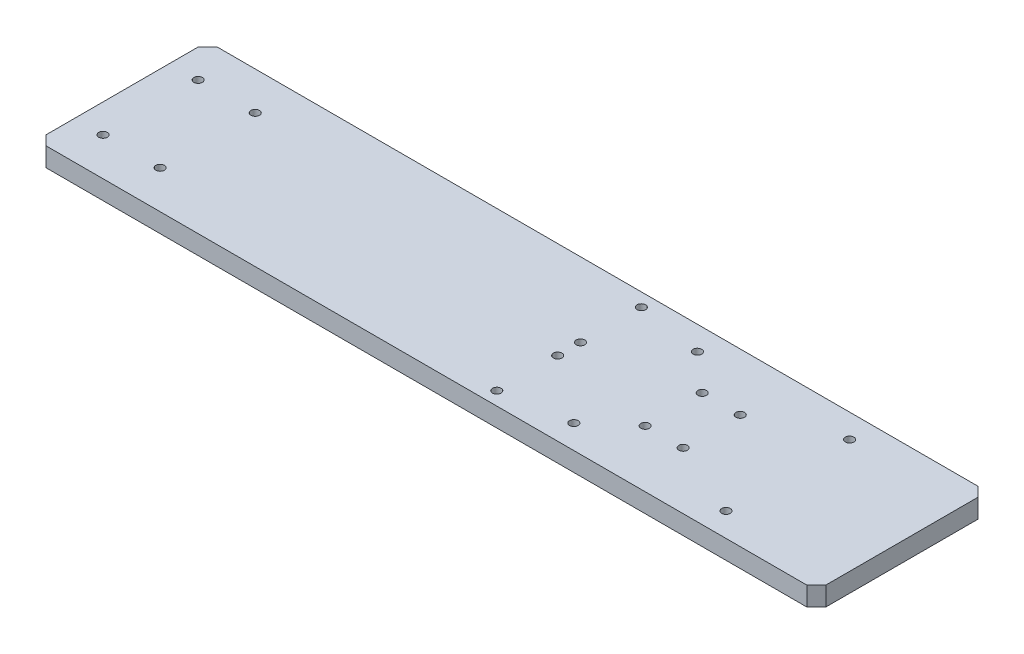
ISO-10303-21;
HEADER;
FILE_DESCRIPTION(('STEP AP214'),'2;1');
FILE_NAME('part.step','',(''),(''),'','','');
FILE_SCHEMA(('AUTOMOTIVE_DESIGN { 1 0 10303 214 1 1 1 1 }'));
ENDSEC;
DATA;
#1=APPLICATION_CONTEXT('core data for automotive mechanical design processes');
#2=APPLICATION_PROTOCOL_DEFINITION('international standard','automotive_design',2000,#1);
#3=PRODUCT_CONTEXT('',#1,'mechanical');
#4=PRODUCT('Part','Part','',(#3));
#5=PRODUCT_RELATED_PRODUCT_CATEGORY('part','',(#4));
#6=PRODUCT_DEFINITION_FORMATION('','',#4);
#7=PRODUCT_DEFINITION_CONTEXT('part definition',#1,'design');
#8=PRODUCT_DEFINITION('design','',#6,#7);
#9=PRODUCT_DEFINITION_SHAPE('','',#8);
#10=(LENGTH_UNIT() NAMED_UNIT(*) SI_UNIT(.MILLI.,.METRE.));
#11=(NAMED_UNIT(*) PLANE_ANGLE_UNIT() SI_UNIT($,.RADIAN.));
#12=(NAMED_UNIT(*) SI_UNIT($,.STERADIAN.) SOLID_ANGLE_UNIT());
#13=UNCERTAINTY_MEASURE_WITH_UNIT(LENGTH_MEASURE(1.E-05),#10,'distance_accuracy_value','');
#14=(GEOMETRIC_REPRESENTATION_CONTEXT(3) GLOBAL_UNCERTAINTY_ASSIGNED_CONTEXT((#13)) GLOBAL_UNIT_ASSIGNED_CONTEXT((#10,
#11,#12)) REPRESENTATION_CONTEXT('',''));
#15=CARTESIAN_POINT('',(0.,0.,0.));
#16=DIRECTION('',(0.,0.,1.));
#17=DIRECTION('',(1.,0.,0.));
#18=AXIS2_PLACEMENT_3D('',#15,#16,#17);
#19=CARTESIAN_POINT('',(410.,10.,45.));
#20=DIRECTION('',(-1.,0.,0.));
#21=DIRECTION('',(0.,0.,1.));
#22=AXIS2_PLACEMENT_3D('',#19,#20,#21);
#23=PLANE('',#22);
#24=DIRECTION('',(0.,0.,-1.));
#25=VECTOR('',#24,1.);
#26=CARTESIAN_POINT('',(410.,10.,45.));
#27=LINE('',#26,#25);
#28=CARTESIAN_POINT('',(410.,10.,40.));
#29=VERTEX_POINT('',#28);
#30=CARTESIAN_POINT('',(410.,10.,-40.));
#31=VERTEX_POINT('',#30);
#32=EDGE_CURVE('E129',#29,#31,#27,.T.);
#33=ORIENTED_EDGE('',*,*,#32,.F.);
#34=DIRECTION('',(0.,-1.,0.));
#35=VECTOR('',#34,1.);
#36=CARTESIAN_POINT('',(410.,10.,40.));
#37=LINE('',#36,#35);
#38=CARTESIAN_POINT('',(410.,0.,40.));
#39=VERTEX_POINT('',#38);
#40=EDGE_CURVE('E11',#29,#39,#37,.T.);
#41=ORIENTED_EDGE('',*,*,#40,.T.);
#42=DIRECTION('',(0.,0.,-1.));
#43=VECTOR('',#42,1.);
#44=CARTESIAN_POINT('',(410.,0.,45.));
#45=LINE('',#44,#43);
#46=CARTESIAN_POINT('',(410.,0.,-40.));
#47=VERTEX_POINT('',#46);
#48=EDGE_CURVE('E131',#39,#47,#45,.T.);
#49=ORIENTED_EDGE('',*,*,#48,.T.);
#50=DIRECTION('',(0.,1.,0.));
#51=VECTOR('',#50,1.);
#52=CARTESIAN_POINT('',(410.,10.,-40.));
#53=LINE('',#52,#51);
#54=EDGE_CURVE('E42',#47,#31,#53,.T.);
#55=ORIENTED_EDGE('',*,*,#54,.T.);
#56=EDGE_LOOP('',(#33,#41,#49,#55));
#57=FACE_BOUND('',#56,.T.);
#58=ADVANCED_FACE('F34',(#57),#23,.F.);
#59=CARTESIAN_POINT('',(0.,10.,-45.));
#60=DIRECTION('',(0.,0.,1.));
#61=DIRECTION('',(1.,0.,0.));
#62=AXIS2_PLACEMENT_3D('',#59,#60,#61);
#63=PLANE('',#62);
#64=DIRECTION('',(-1.,0.,0.));
#65=VECTOR('',#64,1.);
#66=CARTESIAN_POINT('',(0.,0.,-45.));
#67=LINE('',#66,#65);
#68=CARTESIAN_POINT('',(405.,0.,-45.));
#69=VERTEX_POINT('',#68);
#70=CARTESIAN_POINT('',(4.99999999999995,0.,-45.));
#71=VERTEX_POINT('',#70);
#72=EDGE_CURVE('E127',#69,#71,#67,.T.);
#73=ORIENTED_EDGE('',*,*,#72,.T.);
#74=DIRECTION('',(0.,1.,0.));
#75=VECTOR('',#74,1.);
#76=CARTESIAN_POINT('',(4.99999999999995,10.,-45.));
#77=LINE('',#76,#75);
#78=CARTESIAN_POINT('',(4.99999999999995,10.,-45.));
#79=VERTEX_POINT('',#78);
#80=EDGE_CURVE('E106',#71,#79,#77,.T.);
#81=ORIENTED_EDGE('',*,*,#80,.T.);
#82=DIRECTION('',(-1.,0.,0.));
#83=VECTOR('',#82,1.);
#84=CARTESIAN_POINT('',(0.,10.,-45.));
#85=LINE('',#84,#83);
#86=CARTESIAN_POINT('',(405.,10.,-45.));
#87=VERTEX_POINT('',#86);
#88=EDGE_CURVE('E167',#87,#79,#85,.T.);
#89=ORIENTED_EDGE('',*,*,#88,.F.);
#90=DIRECTION('',(0.,-1.,0.));
#91=VECTOR('',#90,1.);
#92=CARTESIAN_POINT('',(405.,10.,-45.));
#93=LINE('',#92,#91);
#94=EDGE_CURVE('E111',#87,#69,#93,.T.);
#95=ORIENTED_EDGE('',*,*,#94,.T.);
#96=EDGE_LOOP('',(#73,#81,#89,#95));
#97=FACE_BOUND('',#96,.T.);
#98=ADVANCED_FACE('F171',(#97),#63,.F.);
#99=CARTESIAN_POINT('',(0.,10.,45.));
#100=DIRECTION('',(1.,0.,0.));
#101=DIRECTION('',(0.,0.,-1.));
#102=AXIS2_PLACEMENT_3D('',#99,#100,#101);
#103=PLANE('',#102);
#104=DIRECTION('',(0.,0.,1.));
#105=VECTOR('',#104,1.);
#106=CARTESIAN_POINT('',(0.,10.,45.));
#107=LINE('',#106,#105);
#108=CARTESIAN_POINT('',(0.,10.,-40.));
#109=VERTEX_POINT('',#108);
#110=CARTESIAN_POINT('',(0.,10.,40.));
#111=VERTEX_POINT('',#110);
#112=EDGE_CURVE('E120',#109,#111,#107,.T.);
#113=ORIENTED_EDGE('',*,*,#112,.F.);
#114=DIRECTION('',(0.,-1.,0.));
#115=VECTOR('',#114,1.);
#116=CARTESIAN_POINT('',(0.,10.,-40.));
#117=LINE('',#116,#115);
#118=CARTESIAN_POINT('',(0.,0.,-40.));
#119=VERTEX_POINT('',#118);
#120=EDGE_CURVE('E105',#109,#119,#117,.T.);
#121=ORIENTED_EDGE('',*,*,#120,.T.);
#122=DIRECTION('',(0.,0.,1.));
#123=VECTOR('',#122,1.);
#124=CARTESIAN_POINT('',(0.,0.,45.));
#125=LINE('',#124,#123);
#126=CARTESIAN_POINT('',(0.,0.,40.));
#127=VERTEX_POINT('',#126);
#128=EDGE_CURVE('E118',#119,#127,#125,.T.);
#129=ORIENTED_EDGE('',*,*,#128,.T.);
#130=DIRECTION('',(0.,1.,0.));
#131=VECTOR('',#130,1.);
#132=CARTESIAN_POINT('',(0.,10.,40.));
#133=LINE('',#132,#131);
#134=EDGE_CURVE('E122',#127,#111,#133,.T.);
#135=ORIENTED_EDGE('',*,*,#134,.T.);
#136=EDGE_LOOP('',(#113,#121,#129,#135));
#137=FACE_BOUND('',#136,.T.);
#138=ADVANCED_FACE('F117',(#137),#103,.F.);
#139=CARTESIAN_POINT('',(0.,10.,45.));
#140=DIRECTION('',(0.,0.,-1.));
#141=DIRECTION('',(-1.,0.,0.));
#142=AXIS2_PLACEMENT_3D('',#139,#140,#141);
#143=PLANE('',#142);
#144=DIRECTION('',(1.,0.,0.));
#145=VECTOR('',#144,1.);
#146=CARTESIAN_POINT('',(0.,10.,45.));
#147=LINE('',#146,#145);
#148=CARTESIAN_POINT('',(4.99999999999995,10.,45.));
#149=VERTEX_POINT('',#148);
#150=CARTESIAN_POINT('',(405.,10.,45.));
#151=VERTEX_POINT('',#150);
#152=EDGE_CURVE('E135',#149,#151,#147,.T.);
#153=ORIENTED_EDGE('',*,*,#152,.F.);
#154=DIRECTION('',(0.,-1.,0.));
#155=VECTOR('',#154,1.);
#156=CARTESIAN_POINT('',(4.99999999999995,10.,45.));
#157=LINE('',#156,#155);
#158=CARTESIAN_POINT('',(4.99999999999995,0.,45.));
#159=VERTEX_POINT('',#158);
#160=EDGE_CURVE('E152',#149,#159,#157,.T.);
#161=ORIENTED_EDGE('',*,*,#160,.T.);
#162=DIRECTION('',(1.,0.,0.));
#163=VECTOR('',#162,1.);
#164=CARTESIAN_POINT('',(0.,0.,45.));
#165=LINE('',#164,#163);
#166=CARTESIAN_POINT('',(405.,0.,45.));
#167=VERTEX_POINT('',#166);
#168=EDGE_CURVE('E126',#159,#167,#165,.T.);
#169=ORIENTED_EDGE('',*,*,#168,.T.);
#170=DIRECTION('',(0.,1.,0.));
#171=VECTOR('',#170,1.);
#172=CARTESIAN_POINT('',(405.,10.,45.));
#173=LINE('',#172,#171);
#174=EDGE_CURVE('E49',#167,#151,#173,.T.);
#175=ORIENTED_EDGE('',*,*,#174,.T.);
#176=EDGE_LOOP('',(#153,#161,#169,#175));
#177=FACE_BOUND('',#176,.T.);
#178=ADVANCED_FACE('F628',(#177),#143,.F.);
#179=CARTESIAN_POINT('',(0.,10.,0.));
#180=DIRECTION('',(0.,-1.,0.));
#181=DIRECTION('',(0.,0.,-1.));
#182=AXIS2_PLACEMENT_3D('',#179,#180,#181);
#183=PLANE('',#182);
#184=CARTESIAN_POINT('',(270.,9.99999999999999,-32.5));
#185=DIRECTION('',(0.,-1.,0.));
#186=DIRECTION('',(0.,0.,-1.));
#187=AXIS2_PLACEMENT_3D('',#184,#185,#186);
#188=CIRCLE('',#187,2.24999999999997);
#189=CARTESIAN_POINT('',(270.,9.99999999999999,-34.75));
#190=VERTEX_POINT('',#189);
#191=EDGE_CURVE('E311',#190,#190,#188,.T.);
#192=ORIENTED_EDGE('',*,*,#191,.T.);
#193=EDGE_LOOP('',(#192));
#194=FACE_BOUND('',#193,.T.);
#195=CARTESIAN_POINT('',(350.,9.99999999999999,32.5));
#196=DIRECTION('',(0.,-1.,0.));
#197=DIRECTION('',(0.,0.,-1.));
#198=AXIS2_PLACEMENT_3D('',#195,#196,#197);
#199=CIRCLE('',#198,2.24999999999997);
#200=CARTESIAN_POINT('',(350.,9.99999999999999,30.25));
#201=VERTEX_POINT('',#200);
#202=EDGE_CURVE('E302',#201,#201,#199,.T.);
#203=ORIENTED_EDGE('',*,*,#202,.T.);
#204=EDGE_LOOP('',(#203));
#205=FACE_BOUND('',#204,.T.);
#206=CARTESIAN_POINT('',(350.,9.99999999999999,-32.5));
#207=DIRECTION('',(0.,-1.,0.));
#208=DIRECTION('',(0.,0.,-1.));
#209=AXIS2_PLACEMENT_3D('',#206,#207,#208);
#210=CIRCLE('',#209,2.24999999999997);
#211=CARTESIAN_POINT('',(350.,9.99999999999999,-34.75));
#212=VERTEX_POINT('',#211);
#213=EDGE_CURVE('E293',#212,#212,#210,.T.);
#214=ORIENTED_EDGE('',*,*,#213,.T.);
#215=EDGE_LOOP('',(#214));
#216=FACE_BOUND('',#215,.T.);
#217=CARTESIAN_POINT('',(270.,9.99999999999999,32.5));
#218=DIRECTION('',(0.,-1.,0.));
#219=DIRECTION('',(0.,0.,-1.));
#220=AXIS2_PLACEMENT_3D('',#217,#218,#219);
#221=CIRCLE('',#220,2.24999999999997);
#222=CARTESIAN_POINT('',(270.,9.99999999999999,30.25));
#223=VERTEX_POINT('',#222);
#224=EDGE_CURVE('E284',#223,#223,#221,.T.);
#225=ORIENTED_EDGE('',*,*,#224,.T.);
#226=EDGE_LOOP('',(#225));
#227=FACE_BOUND('',#226,.T.);
#228=CARTESIAN_POINT('',(290.,10.,-15.));
#229=DIRECTION('',(0.,-1.,0.));
#230=DIRECTION('',(0.,0.,-1.));
#231=AXIS2_PLACEMENT_3D('',#228,#229,#230);
#232=CIRCLE('',#231,2.24999999999997);
#233=CARTESIAN_POINT('',(290.,10.,-17.25));
#234=VERTEX_POINT('',#233);
#235=EDGE_CURVE('E275',#234,#234,#232,.T.);
#236=ORIENTED_EDGE('',*,*,#235,.T.);
#237=EDGE_LOOP('',(#236));
#238=FACE_BOUND('',#237,.T.);
#239=CARTESIAN_POINT('',(310.,10.,15.));
#240=DIRECTION('',(0.,-1.,0.));
#241=DIRECTION('',(0.,0.,-1.));
#242=AXIS2_PLACEMENT_3D('',#239,#240,#241);
#243=CIRCLE('',#242,2.24999999999997);
#244=CARTESIAN_POINT('',(310.,10.,12.75));
#245=VERTEX_POINT('',#244);
#246=EDGE_CURVE('E266',#245,#245,#243,.T.);
#247=ORIENTED_EDGE('',*,*,#246,.T.);
#248=EDGE_LOOP('',(#247));
#249=FACE_BOUND('',#248,.T.);
#250=CARTESIAN_POINT('',(310.,10.,-15.));
#251=DIRECTION('',(0.,-1.,0.));
#252=DIRECTION('',(0.,0.,-1.));
#253=AXIS2_PLACEMENT_3D('',#250,#251,#252);
#254=CIRCLE('',#253,2.24999999999997);
#255=CARTESIAN_POINT('',(310.,10.,-17.25));
#256=VERTEX_POINT('',#255);
#257=EDGE_CURVE('E257',#256,#256,#254,.T.);
#258=ORIENTED_EDGE('',*,*,#257,.T.);
#259=EDGE_LOOP('',(#258));
#260=FACE_BOUND('',#259,.T.);
#261=CARTESIAN_POINT('',(290.,10.,15.));
#262=DIRECTION('',(0.,-1.,0.));
#263=DIRECTION('',(0.,0.,-1.));
#264=AXIS2_PLACEMENT_3D('',#261,#262,#263);
#265=CIRCLE('',#264,2.24999999999997);
#266=CARTESIAN_POINT('',(290.,10.,12.75));
#267=VERTEX_POINT('',#266);
#268=EDGE_CURVE('E248',#267,#267,#265,.T.);
#269=ORIENTED_EDGE('',*,*,#268,.T.);
#270=EDGE_LOOP('',(#269));
#271=FACE_BOUND('',#270,.T.);
#272=CARTESIAN_POINT('',(235.,10.,-38.));
#273=DIRECTION('',(0.,-1.,0.));
#274=DIRECTION('',(0.,0.,-1.));
#275=AXIS2_PLACEMENT_3D('',#272,#273,#274);
#276=CIRCLE('',#275,2.25);
#277=CARTESIAN_POINT('',(235.,10.,-40.25));
#278=VERTEX_POINT('',#277);
#279=EDGE_CURVE('E239',#278,#278,#276,.T.);
#280=ORIENTED_EDGE('',*,*,#279,.T.);
#281=EDGE_LOOP('',(#280));
#282=FACE_BOUND('',#281,.T.);
#283=CARTESIAN_POINT('',(235.,10.,-6.));
#284=DIRECTION('',(0.,-1.,0.));
#285=DIRECTION('',(0.,0.,-1.));
#286=AXIS2_PLACEMENT_3D('',#283,#284,#285);
#287=CIRCLE('',#286,2.25);
#288=CARTESIAN_POINT('',(235.,10.,-8.25));
#289=VERTEX_POINT('',#288);
#290=EDGE_CURVE('E230',#289,#289,#287,.T.);
#291=ORIENTED_EDGE('',*,*,#290,.T.);
#292=EDGE_LOOP('',(#291));
#293=FACE_BOUND('',#292,.T.);
#294=CARTESIAN_POINT('',(235.,10.,6.));
#295=DIRECTION('',(0.,-1.,0.));
#296=DIRECTION('',(0.,0.,-1.));
#297=AXIS2_PLACEMENT_3D('',#294,#295,#296);
#298=CIRCLE('',#297,2.25);
#299=CARTESIAN_POINT('',(235.,10.,3.75));
#300=VERTEX_POINT('',#299);
#301=EDGE_CURVE('E221',#300,#300,#298,.T.);
#302=ORIENTED_EDGE('',*,*,#301,.T.);
#303=EDGE_LOOP('',(#302));
#304=FACE_BOUND('',#303,.T.);
#305=CARTESIAN_POINT('',(235.,10.,38.));
#306=DIRECTION('',(0.,-1.,0.));
#307=DIRECTION('',(0.,0.,-1.));
#308=AXIS2_PLACEMENT_3D('',#305,#306,#307);
#309=CIRCLE('',#308,2.25);
#310=CARTESIAN_POINT('',(235.,10.,35.75));
#311=VERTEX_POINT('',#310);
#312=EDGE_CURVE('E212',#311,#311,#309,.T.);
#313=ORIENTED_EDGE('',*,*,#312,.T.);
#314=EDGE_LOOP('',(#313));
#315=FACE_BOUND('',#314,.T.);
#316=CARTESIAN_POINT('',(15.,10.,25.));
#317=DIRECTION('',(0.,-1.,0.));
#318=DIRECTION('',(0.,0.,-1.));
#319=AXIS2_PLACEMENT_3D('',#316,#317,#318);
#320=CIRCLE('',#319,2.25);
#321=CARTESIAN_POINT('',(15.,10.,22.75));
#322=VERTEX_POINT('',#321);
#323=EDGE_CURVE('E203',#322,#322,#320,.T.);
#324=ORIENTED_EDGE('',*,*,#323,.T.);
#325=EDGE_LOOP('',(#324));
#326=FACE_BOUND('',#325,.T.);
#327=CARTESIAN_POINT('',(45.,10.,-25.));
#328=DIRECTION('',(0.,-1.,0.));
#329=DIRECTION('',(0.,0.,-1.));
#330=AXIS2_PLACEMENT_3D('',#327,#328,#329);
#331=CIRCLE('',#330,2.25);
#332=CARTESIAN_POINT('',(45.,10.,-27.25));
#333=VERTEX_POINT('',#332);
#334=EDGE_CURVE('E194',#333,#333,#331,.T.);
#335=ORIENTED_EDGE('',*,*,#334,.T.);
#336=EDGE_LOOP('',(#335));
#337=FACE_BOUND('',#336,.T.);
#338=CARTESIAN_POINT('',(45.,10.,25.));
#339=DIRECTION('',(0.,-1.,0.));
#340=DIRECTION('',(0.,0.,-1.));
#341=AXIS2_PLACEMENT_3D('',#338,#339,#340);
#342=CIRCLE('',#341,2.25);
#343=CARTESIAN_POINT('',(45.,10.,22.75));
#344=VERTEX_POINT('',#343);
#345=EDGE_CURVE('E185',#344,#344,#342,.T.);
#346=ORIENTED_EDGE('',*,*,#345,.T.);
#347=EDGE_LOOP('',(#346));
#348=FACE_BOUND('',#347,.T.);
#349=CARTESIAN_POINT('',(15.,10.,-25.));
#350=DIRECTION('',(0.,-1.,0.));
#351=DIRECTION('',(0.,0.,-1.));
#352=AXIS2_PLACEMENT_3D('',#349,#350,#351);
#353=CIRCLE('',#352,2.25);
#354=CARTESIAN_POINT('',(15.,10.,-27.25));
#355=VERTEX_POINT('',#354);
#356=EDGE_CURVE('E172',#355,#355,#353,.T.);
#357=ORIENTED_EDGE('',*,*,#356,.T.);
#358=EDGE_LOOP('',(#357));
#359=FACE_BOUND('',#358,.T.);
#360=ORIENTED_EDGE('',*,*,#88,.T.);
#361=DIRECTION('',(0.707106781186548,0.,-0.707106781186548));
#362=VECTOR('',#361,1.);
#363=CARTESIAN_POINT('',(0.,10.,-40.));
#364=LINE('',#363,#362);
#365=EDGE_CURVE('E149',#79,#109,#364,.F.);
#366=ORIENTED_EDGE('',*,*,#365,.T.);
#367=ORIENTED_EDGE('',*,*,#112,.T.);
#368=DIRECTION('',(-0.707106781186544,0.,-0.707106781186551));
#369=VECTOR('',#368,1.);
#370=CARTESIAN_POINT('',(4.99999999999995,10.,45.));
#371=LINE('',#370,#369);
#372=EDGE_CURVE('E56',#111,#149,#371,.F.);
#373=ORIENTED_EDGE('',*,*,#372,.T.);
#374=ORIENTED_EDGE('',*,*,#152,.T.);
#375=DIRECTION('',(-0.707106781186548,0.,0.707106781186548));
#376=VECTOR('',#375,1.);
#377=CARTESIAN_POINT('',(410.,10.,40.));
#378=LINE('',#377,#376);
#379=EDGE_CURVE('E146',#151,#29,#378,.F.);
#380=ORIENTED_EDGE('',*,*,#379,.T.);
#381=ORIENTED_EDGE('',*,*,#32,.T.);
#382=DIRECTION('',(0.707106781186549,0.,0.707106781186547));
#383=VECTOR('',#382,1.);
#384=CARTESIAN_POINT('',(405.,10.,-45.));
#385=LINE('',#384,#383);
#386=EDGE_CURVE('E144',#31,#87,#385,.F.);
#387=ORIENTED_EDGE('',*,*,#386,.T.);
#388=EDGE_LOOP('',(#360,#366,#367,#373,#374,#380,#381,#387));
#389=FACE_BOUND('',#388,.T.);
#390=ADVANCED_FACE('F164',(#194,#205,#216,#227,#238,#249,#260,#271,#282,#293,#304,#315,#326,
#337,#348,#359,#389),#183,.F.);
#391=CARTESIAN_POINT('',(0.,0.,0.));
#392=DIRECTION('',(0.,-1.,0.));
#393=DIRECTION('',(0.,0.,-1.));
#394=AXIS2_PLACEMENT_3D('',#391,#392,#393);
#395=PLANE('',#394);
#396=CARTESIAN_POINT('',(270.,0.,-32.5));
#397=DIRECTION('',(0.,-1.,0.));
#398=DIRECTION('',(0.,0.,-1.));
#399=AXIS2_PLACEMENT_3D('',#396,#397,#398);
#400=CIRCLE('',#399,4.58999999999998);
#401=CARTESIAN_POINT('',(270.,0.,-37.09));
#402=VERTEX_POINT('',#401);
#403=EDGE_CURVE('E317',#402,#402,#400,.T.);
#404=ORIENTED_EDGE('',*,*,#403,.F.);
#405=EDGE_LOOP('',(#404));
#406=FACE_BOUND('',#405,.T.);
#407=CARTESIAN_POINT('',(350.,0.,32.5));
#408=DIRECTION('',(0.,-1.,0.));
#409=DIRECTION('',(0.,0.,-1.));
#410=AXIS2_PLACEMENT_3D('',#407,#408,#409);
#411=CIRCLE('',#410,4.58999999999998);
#412=CARTESIAN_POINT('',(350.,0.,27.91));
#413=VERTEX_POINT('',#412);
#414=EDGE_CURVE('E308',#413,#413,#411,.T.);
#415=ORIENTED_EDGE('',*,*,#414,.F.);
#416=EDGE_LOOP('',(#415));
#417=FACE_BOUND('',#416,.T.);
#418=CARTESIAN_POINT('',(350.,0.,-32.5));
#419=DIRECTION('',(0.,-1.,0.));
#420=DIRECTION('',(0.,0.,-1.));
#421=AXIS2_PLACEMENT_3D('',#418,#419,#420);
#422=CIRCLE('',#421,4.58999999999998);
#423=CARTESIAN_POINT('',(350.,0.,-37.09));
#424=VERTEX_POINT('',#423);
#425=EDGE_CURVE('E299',#424,#424,#422,.T.);
#426=ORIENTED_EDGE('',*,*,#425,.F.);
#427=EDGE_LOOP('',(#426));
#428=FACE_BOUND('',#427,.T.);
#429=CARTESIAN_POINT('',(270.,0.,32.5));
#430=DIRECTION('',(0.,-1.,0.));
#431=DIRECTION('',(0.,0.,-1.));
#432=AXIS2_PLACEMENT_3D('',#429,#430,#431);
#433=CIRCLE('',#432,4.58999999999998);
#434=CARTESIAN_POINT('',(270.,0.,27.91));
#435=VERTEX_POINT('',#434);
#436=EDGE_CURVE('E290',#435,#435,#433,.T.);
#437=ORIENTED_EDGE('',*,*,#436,.F.);
#438=EDGE_LOOP('',(#437));
#439=FACE_BOUND('',#438,.T.);
#440=CARTESIAN_POINT('',(290.,0.,-15.));
#441=DIRECTION('',(0.,-1.,0.));
#442=DIRECTION('',(0.,0.,-1.));
#443=AXIS2_PLACEMENT_3D('',#440,#441,#442);
#444=CIRCLE('',#443,4.58999999999998);
#445=CARTESIAN_POINT('',(290.,0.,-19.59));
#446=VERTEX_POINT('',#445);
#447=EDGE_CURVE('E281',#446,#446,#444,.T.);
#448=ORIENTED_EDGE('',*,*,#447,.F.);
#449=EDGE_LOOP('',(#448));
#450=FACE_BOUND('',#449,.T.);
#451=CARTESIAN_POINT('',(310.,0.,15.));
#452=DIRECTION('',(0.,-1.,0.));
#453=DIRECTION('',(0.,0.,-1.));
#454=AXIS2_PLACEMENT_3D('',#451,#452,#453);
#455=CIRCLE('',#454,4.58999999999998);
#456=CARTESIAN_POINT('',(310.,0.,10.41));
#457=VERTEX_POINT('',#456);
#458=EDGE_CURVE('E272',#457,#457,#455,.T.);
#459=ORIENTED_EDGE('',*,*,#458,.F.);
#460=EDGE_LOOP('',(#459));
#461=FACE_BOUND('',#460,.T.);
#462=CARTESIAN_POINT('',(310.,0.,-15.));
#463=DIRECTION('',(0.,-1.,0.));
#464=DIRECTION('',(0.,0.,-1.));
#465=AXIS2_PLACEMENT_3D('',#462,#463,#464);
#466=CIRCLE('',#465,4.58999999999998);
#467=CARTESIAN_POINT('',(310.,0.,-19.59));
#468=VERTEX_POINT('',#467);
#469=EDGE_CURVE('E263',#468,#468,#466,.T.);
#470=ORIENTED_EDGE('',*,*,#469,.F.);
#471=EDGE_LOOP('',(#470));
#472=FACE_BOUND('',#471,.T.);
#473=CARTESIAN_POINT('',(290.,0.,15.));
#474=DIRECTION('',(0.,-1.,0.));
#475=DIRECTION('',(0.,0.,-1.));
#476=AXIS2_PLACEMENT_3D('',#473,#474,#475);
#477=CIRCLE('',#476,4.58999999999998);
#478=CARTESIAN_POINT('',(290.,0.,10.41));
#479=VERTEX_POINT('',#478);
#480=EDGE_CURVE('E254',#479,#479,#477,.T.);
#481=ORIENTED_EDGE('',*,*,#480,.F.);
#482=EDGE_LOOP('',(#481));
#483=FACE_BOUND('',#482,.T.);
#484=CARTESIAN_POINT('',(235.,0.,-38.));
#485=DIRECTION('',(0.,-1.,0.));
#486=DIRECTION('',(0.,0.,-1.));
#487=AXIS2_PLACEMENT_3D('',#484,#485,#486);
#488=CIRCLE('',#487,4.59000000000001);
#489=CARTESIAN_POINT('',(235.,0.,-42.59));
#490=VERTEX_POINT('',#489);
#491=EDGE_CURVE('E245',#490,#490,#488,.T.);
#492=ORIENTED_EDGE('',*,*,#491,.F.);
#493=EDGE_LOOP('',(#492));
#494=FACE_BOUND('',#493,.T.);
#495=CARTESIAN_POINT('',(235.,0.,-6.));
#496=DIRECTION('',(0.,-1.,0.));
#497=DIRECTION('',(0.,0.,-1.));
#498=AXIS2_PLACEMENT_3D('',#495,#496,#497);
#499=CIRCLE('',#498,4.59000000000001);
#500=CARTESIAN_POINT('',(235.,0.,-10.59));
#501=VERTEX_POINT('',#500);
#502=EDGE_CURVE('E236',#501,#501,#499,.T.);
#503=ORIENTED_EDGE('',*,*,#502,.F.);
#504=EDGE_LOOP('',(#503));
#505=FACE_BOUND('',#504,.T.);
#506=CARTESIAN_POINT('',(235.,0.,6.));
#507=DIRECTION('',(0.,-1.,0.));
#508=DIRECTION('',(0.,0.,-1.));
#509=AXIS2_PLACEMENT_3D('',#506,#507,#508);
#510=CIRCLE('',#509,4.59000000000001);
#511=CARTESIAN_POINT('',(235.,0.,1.40999999999999));
#512=VERTEX_POINT('',#511);
#513=EDGE_CURVE('E227',#512,#512,#510,.T.);
#514=ORIENTED_EDGE('',*,*,#513,.F.);
#515=EDGE_LOOP('',(#514));
#516=FACE_BOUND('',#515,.T.);
#517=CARTESIAN_POINT('',(235.,0.,38.));
#518=DIRECTION('',(0.,-1.,0.));
#519=DIRECTION('',(0.,0.,-1.));
#520=AXIS2_PLACEMENT_3D('',#517,#518,#519);
#521=CIRCLE('',#520,4.59000000000001);
#522=CARTESIAN_POINT('',(235.,0.,33.41));
#523=VERTEX_POINT('',#522);
#524=EDGE_CURVE('E218',#523,#523,#521,.T.);
#525=ORIENTED_EDGE('',*,*,#524,.F.);
#526=EDGE_LOOP('',(#525));
#527=FACE_BOUND('',#526,.T.);
#528=CARTESIAN_POINT('',(15.,0.,25.));
#529=DIRECTION('',(0.,-1.,0.));
#530=DIRECTION('',(0.,0.,-1.));
#531=AXIS2_PLACEMENT_3D('',#528,#529,#530);
#532=CIRCLE('',#531,4.59);
#533=CARTESIAN_POINT('',(15.,0.,20.41));
#534=VERTEX_POINT('',#533);
#535=EDGE_CURVE('E209',#534,#534,#532,.T.);
#536=ORIENTED_EDGE('',*,*,#535,.F.);
#537=EDGE_LOOP('',(#536));
#538=FACE_BOUND('',#537,.T.);
#539=CARTESIAN_POINT('',(45.,0.,-25.));
#540=DIRECTION('',(0.,-1.,0.));
#541=DIRECTION('',(0.,0.,-1.));
#542=AXIS2_PLACEMENT_3D('',#539,#540,#541);
#543=CIRCLE('',#542,4.59);
#544=CARTESIAN_POINT('',(45.,0.,-29.59));
#545=VERTEX_POINT('',#544);
#546=EDGE_CURVE('E200',#545,#545,#543,.T.);
#547=ORIENTED_EDGE('',*,*,#546,.F.);
#548=EDGE_LOOP('',(#547));
#549=FACE_BOUND('',#548,.T.);
#550=CARTESIAN_POINT('',(45.,0.,25.));
#551=DIRECTION('',(0.,-1.,0.));
#552=DIRECTION('',(0.,0.,-1.));
#553=AXIS2_PLACEMENT_3D('',#550,#551,#552);
#554=CIRCLE('',#553,4.59);
#555=CARTESIAN_POINT('',(45.,0.,20.41));
#556=VERTEX_POINT('',#555);
#557=EDGE_CURVE('E191',#556,#556,#554,.T.);
#558=ORIENTED_EDGE('',*,*,#557,.F.);
#559=EDGE_LOOP('',(#558));
#560=FACE_BOUND('',#559,.T.);
#561=CARTESIAN_POINT('',(15.,0.,-25.));
#562=DIRECTION('',(0.,-1.,0.));
#563=DIRECTION('',(0.,0.,-1.));
#564=AXIS2_PLACEMENT_3D('',#561,#562,#563);
#565=CIRCLE('',#564,4.59);
#566=CARTESIAN_POINT('',(15.,0.,-29.59));
#567=VERTEX_POINT('',#566);
#568=EDGE_CURVE('E182',#567,#567,#565,.T.);
#569=ORIENTED_EDGE('',*,*,#568,.F.);
#570=EDGE_LOOP('',(#569));
#571=FACE_BOUND('',#570,.T.);
#572=ORIENTED_EDGE('',*,*,#128,.F.);
#573=DIRECTION('',(-0.707106781186548,0.,0.707106781186548));
#574=VECTOR('',#573,1.);
#575=CARTESIAN_POINT('',(-20.,0.,-20.));
#576=LINE('',#575,#574);
#577=EDGE_CURVE('E101',#119,#71,#576,.F.);
#578=ORIENTED_EDGE('',*,*,#577,.T.);
#579=ORIENTED_EDGE('',*,*,#72,.F.);
#580=DIRECTION('',(-0.707106781186549,0.,-0.707106781186547));
#581=VECTOR('',#580,1.);
#582=CARTESIAN_POINT('',(224.999999999999,0.,-225.));
#583=LINE('',#582,#581);
#584=EDGE_CURVE('E121',#69,#47,#583,.F.);
#585=ORIENTED_EDGE('',*,*,#584,.T.);
#586=ORIENTED_EDGE('',*,*,#48,.F.);
#587=DIRECTION('',(0.707106781186548,0.,-0.707106781186548));
#588=VECTOR('',#587,1.);
#589=CARTESIAN_POINT('',(225.,0.,225.));
#590=LINE('',#589,#588);
#591=EDGE_CURVE('E138',#39,#167,#590,.F.);
#592=ORIENTED_EDGE('',*,*,#591,.T.);
#593=ORIENTED_EDGE('',*,*,#168,.F.);
#594=DIRECTION('',(0.707106781186544,0.,0.707106781186551));
#595=VECTOR('',#594,1.);
#596=CARTESIAN_POINT('',(-20.,0.,19.9999999999998));
#597=LINE('',#596,#595);
#598=EDGE_CURVE('E112',#159,#127,#597,.F.);
#599=ORIENTED_EDGE('',*,*,#598,.T.);
#600=EDGE_LOOP('',(#572,#578,#579,#585,#586,#592,#593,#599));
#601=FACE_BOUND('',#600,.T.);
#602=ADVANCED_FACE('F124',(#406,#417,#428,#439,#450,#461,#472,#483,#494,#505,#516,#527,#538,
#549,#560,#571,#601),#395,.T.);
#603=CARTESIAN_POINT('',(0.,10.,-40.));
#604=DIRECTION('',(0.707106781186547,0.,0.707106781186547));
#605=DIRECTION('',(0.,-1.,0.));
#606=AXIS2_PLACEMENT_3D('',#603,#604,#605);
#607=PLANE('',#606);
#608=ORIENTED_EDGE('',*,*,#365,.F.);
#609=ORIENTED_EDGE('',*,*,#80,.F.);
#610=ORIENTED_EDGE('',*,*,#577,.F.);
#611=ORIENTED_EDGE('',*,*,#120,.F.);
#612=EDGE_LOOP('',(#608,#609,#610,#611));
#613=FACE_BOUND('',#612,.T.);
#614=ADVANCED_FACE('F104',(#613),#607,.F.);
#615=CARTESIAN_POINT('',(4.99999999999995,10.,45.));
#616=DIRECTION('',(0.707106781186551,0.,-0.707106781186544));
#617=DIRECTION('',(0.,-1.,0.));
#618=AXIS2_PLACEMENT_3D('',#615,#616,#617);
#619=PLANE('',#618);
#620=ORIENTED_EDGE('',*,*,#372,.F.);
#621=ORIENTED_EDGE('',*,*,#134,.F.);
#622=ORIENTED_EDGE('',*,*,#598,.F.);
#623=ORIENTED_EDGE('',*,*,#160,.F.);
#624=EDGE_LOOP('',(#620,#621,#622,#623));
#625=FACE_BOUND('',#624,.T.);
#626=ADVANCED_FACE('F382',(#625),#619,.F.);
#627=CARTESIAN_POINT('',(410.,10.,40.));
#628=DIRECTION('',(-0.707106781186547,0.,-0.707106781186547));
#629=DIRECTION('',(0.,-1.,0.));
#630=AXIS2_PLACEMENT_3D('',#627,#628,#629);
#631=PLANE('',#630);
#632=ORIENTED_EDGE('',*,*,#379,.F.);
#633=ORIENTED_EDGE('',*,*,#174,.F.);
#634=ORIENTED_EDGE('',*,*,#591,.F.);
#635=ORIENTED_EDGE('',*,*,#40,.F.);
#636=EDGE_LOOP('',(#632,#633,#634,#635));
#637=FACE_BOUND('',#636,.T.);
#638=ADVANCED_FACE('F384',(#637),#631,.F.);
#639=CARTESIAN_POINT('',(405.,10.,-45.));
#640=DIRECTION('',(-0.707106781186546,0.,0.707106781186548));
#641=DIRECTION('',(0.,-1.,0.));
#642=AXIS2_PLACEMENT_3D('',#639,#640,#641);
#643=PLANE('',#642);
#644=ORIENTED_EDGE('',*,*,#386,.F.);
#645=ORIENTED_EDGE('',*,*,#54,.F.);
#646=ORIENTED_EDGE('',*,*,#584,.F.);
#647=ORIENTED_EDGE('',*,*,#94,.F.);
#648=EDGE_LOOP('',(#644,#645,#646,#647));
#649=FACE_BOUND('',#648,.T.);
#650=ADVANCED_FACE('F36',(#649),#643,.F.);
#651=CARTESIAN_POINT('',(15.,0.,-25.));
#652=DIRECTION('',(0.,-1.,0.));
#653=DIRECTION('',(0.,0.,-1.));
#654=AXIS2_PLACEMENT_3D('',#651,#652,#653);
#655=CYLINDRICAL_SURFACE('',#654,2.25);
#656=ORIENTED_EDGE('',*,*,#356,.F.);
#657=EDGE_LOOP('',(#656));
#658=FACE_BOUND('',#657,.T.);
#659=CARTESIAN_POINT('',(15.,2.34,-25.));
#660=DIRECTION('',(0.,-1.,0.));
#661=DIRECTION('',(0.,0.,-1.));
#662=AXIS2_PLACEMENT_3D('',#659,#660,#661);
#663=CIRCLE('',#662,2.25);
#664=CARTESIAN_POINT('',(15.,2.34,-27.25));
#665=VERTEX_POINT('',#664);
#666=EDGE_CURVE('E174',#665,#665,#663,.T.);
#667=ORIENTED_EDGE('',*,*,#666,.T.);
#668=EDGE_LOOP('',(#667));
#669=FACE_BOUND('',#668,.T.);
#670=ADVANCED_FACE('F359',(#658,#669),#655,.F.);
#671=CARTESIAN_POINT('',(15.,0.,-25.));
#672=DIRECTION('',(0.,-1.,0.));
#673=DIRECTION('',(0.,0.,-1.));
#674=AXIS2_PLACEMENT_3D('',#671,#672,#673);
#675=CONICAL_SURFACE('',#674,4.59,0.785398163397449);
#676=ORIENTED_EDGE('',*,*,#666,.F.);
#677=EDGE_LOOP('',(#676));
#678=FACE_BOUND('',#677,.T.);
#679=ORIENTED_EDGE('',*,*,#568,.T.);
#680=EDGE_LOOP('',(#679));
#681=FACE_BOUND('',#680,.T.);
#682=ADVANCED_FACE('F356',(#678,#681),#675,.F.);
#683=CARTESIAN_POINT('',(45.,0.,25.));
#684=DIRECTION('',(0.,-1.,0.));
#685=DIRECTION('',(0.,0.,-1.));
#686=AXIS2_PLACEMENT_3D('',#683,#684,#685);
#687=CYLINDRICAL_SURFACE('',#686,2.25);
#688=ORIENTED_EDGE('',*,*,#345,.F.);
#689=EDGE_LOOP('',(#688));
#690=FACE_BOUND('',#689,.T.);
#691=CARTESIAN_POINT('',(45.,2.34,25.));
#692=DIRECTION('',(0.,-1.,0.));
#693=DIRECTION('',(0.,0.,-1.));
#694=AXIS2_PLACEMENT_3D('',#691,#692,#693);
#695=CIRCLE('',#694,2.25);
#696=CARTESIAN_POINT('',(45.,2.34,22.75));
#697=VERTEX_POINT('',#696);
#698=EDGE_CURVE('E188',#697,#697,#695,.T.);
#699=ORIENTED_EDGE('',*,*,#698,.T.);
#700=EDGE_LOOP('',(#699));
#701=FACE_BOUND('',#700,.T.);
#702=ADVANCED_FACE('F358',(#690,#701),#687,.F.);
#703=CARTESIAN_POINT('',(45.,0.,25.));
#704=DIRECTION('',(0.,-1.,0.));
#705=DIRECTION('',(0.,0.,-1.));
#706=AXIS2_PLACEMENT_3D('',#703,#704,#705);
#707=CONICAL_SURFACE('',#706,4.59,0.785398163397448);
#708=ORIENTED_EDGE('',*,*,#698,.F.);
#709=EDGE_LOOP('',(#708));
#710=FACE_BOUND('',#709,.T.);
#711=ORIENTED_EDGE('',*,*,#557,.T.);
#712=EDGE_LOOP('',(#711));
#713=FACE_BOUND('',#712,.T.);
#714=ADVANCED_FACE('F366',(#710,#713),#707,.F.);
#715=CARTESIAN_POINT('',(45.,0.,-25.));
#716=DIRECTION('',(0.,-1.,0.));
#717=DIRECTION('',(0.,0.,-1.));
#718=AXIS2_PLACEMENT_3D('',#715,#716,#717);
#719=CYLINDRICAL_SURFACE('',#718,2.25);
#720=ORIENTED_EDGE('',*,*,#334,.F.);
#721=EDGE_LOOP('',(#720));
#722=FACE_BOUND('',#721,.T.);
#723=CARTESIAN_POINT('',(45.,2.34,-25.));
#724=DIRECTION('',(0.,-1.,0.));
#725=DIRECTION('',(0.,0.,-1.));
#726=AXIS2_PLACEMENT_3D('',#723,#724,#725);
#727=CIRCLE('',#726,2.25);
#728=CARTESIAN_POINT('',(45.,2.34,-27.25));
#729=VERTEX_POINT('',#728);
#730=EDGE_CURVE('E197',#729,#729,#727,.T.);
#731=ORIENTED_EDGE('',*,*,#730,.T.);
#732=EDGE_LOOP('',(#731));
#733=FACE_BOUND('',#732,.T.);
#734=ADVANCED_FACE('F416',(#722,#733),#719,.F.);
#735=CARTESIAN_POINT('',(45.,0.,-25.));
#736=DIRECTION('',(0.,-1.,0.));
#737=DIRECTION('',(0.,0.,-1.));
#738=AXIS2_PLACEMENT_3D('',#735,#736,#737);
#739=CONICAL_SURFACE('',#738,4.59,0.785398163397448);
#740=ORIENTED_EDGE('',*,*,#730,.F.);
#741=EDGE_LOOP('',(#740));
#742=FACE_BOUND('',#741,.T.);
#743=ORIENTED_EDGE('',*,*,#546,.T.);
#744=EDGE_LOOP('',(#743));
#745=FACE_BOUND('',#744,.T.);
#746=ADVANCED_FACE('F426',(#742,#745),#739,.F.);
#747=CARTESIAN_POINT('',(15.,0.,25.));
#748=DIRECTION('',(0.,-1.,0.));
#749=DIRECTION('',(0.,0.,-1.));
#750=AXIS2_PLACEMENT_3D('',#747,#748,#749);
#751=CYLINDRICAL_SURFACE('',#750,2.25);
#752=ORIENTED_EDGE('',*,*,#323,.F.);
#753=EDGE_LOOP('',(#752));
#754=FACE_BOUND('',#753,.T.);
#755=CARTESIAN_POINT('',(15.,2.34,25.));
#756=DIRECTION('',(0.,-1.,0.));
#757=DIRECTION('',(0.,0.,-1.));
#758=AXIS2_PLACEMENT_3D('',#755,#756,#757);
#759=CIRCLE('',#758,2.25);
#760=CARTESIAN_POINT('',(15.,2.34,22.75));
#761=VERTEX_POINT('',#760);
#762=EDGE_CURVE('E206',#761,#761,#759,.T.);
#763=ORIENTED_EDGE('',*,*,#762,.T.);
#764=EDGE_LOOP('',(#763));
#765=FACE_BOUND('',#764,.T.);
#766=ADVANCED_FACE('F436',(#754,#765),#751,.F.);
#767=CARTESIAN_POINT('',(15.,0.,25.));
#768=DIRECTION('',(0.,-1.,0.));
#769=DIRECTION('',(0.,0.,-1.));
#770=AXIS2_PLACEMENT_3D('',#767,#768,#769);
#771=CONICAL_SURFACE('',#770,4.59,0.785398163397449);
#772=ORIENTED_EDGE('',*,*,#762,.F.);
#773=EDGE_LOOP('',(#772));
#774=FACE_BOUND('',#773,.T.);
#775=ORIENTED_EDGE('',*,*,#535,.T.);
#776=EDGE_LOOP('',(#775));
#777=FACE_BOUND('',#776,.T.);
#778=ADVANCED_FACE('F446',(#774,#777),#771,.F.);
#779=CARTESIAN_POINT('',(235.,0.,38.));
#780=DIRECTION('',(0.,-1.,0.));
#781=DIRECTION('',(0.,0.,-1.));
#782=AXIS2_PLACEMENT_3D('',#779,#780,#781);
#783=CYLINDRICAL_SURFACE('',#782,2.25);
#784=ORIENTED_EDGE('',*,*,#312,.F.);
#785=EDGE_LOOP('',(#784));
#786=FACE_BOUND('',#785,.T.);
#787=CARTESIAN_POINT('',(235.,2.34,38.));
#788=DIRECTION('',(0.,-1.,0.));
#789=DIRECTION('',(0.,0.,-1.));
#790=AXIS2_PLACEMENT_3D('',#787,#788,#789);
#791=CIRCLE('',#790,2.25);
#792=CARTESIAN_POINT('',(235.,2.34,35.75));
#793=VERTEX_POINT('',#792);
#794=EDGE_CURVE('E215',#793,#793,#791,.T.);
#795=ORIENTED_EDGE('',*,*,#794,.T.);
#796=EDGE_LOOP('',(#795));
#797=FACE_BOUND('',#796,.T.);
#798=ADVANCED_FACE('F456',(#786,#797),#783,.F.);
#799=CARTESIAN_POINT('',(235.,0.,38.));
#800=DIRECTION('',(0.,-1.,0.));
#801=DIRECTION('',(0.,0.,-1.));
#802=AXIS2_PLACEMENT_3D('',#799,#800,#801);
#803=CONICAL_SURFACE('',#802,4.59000000000001,0.78539816339745);
#804=ORIENTED_EDGE('',*,*,#794,.F.);
#805=EDGE_LOOP('',(#804));
#806=FACE_BOUND('',#805,.T.);
#807=ORIENTED_EDGE('',*,*,#524,.T.);
#808=EDGE_LOOP('',(#807));
#809=FACE_BOUND('',#808,.T.);
#810=ADVANCED_FACE('F466',(#806,#809),#803,.F.);
#811=CARTESIAN_POINT('',(235.,0.,6.));
#812=DIRECTION('',(0.,-1.,0.));
#813=DIRECTION('',(0.,0.,-1.));
#814=AXIS2_PLACEMENT_3D('',#811,#812,#813);
#815=CYLINDRICAL_SURFACE('',#814,2.25);
#816=ORIENTED_EDGE('',*,*,#301,.F.);
#817=EDGE_LOOP('',(#816));
#818=FACE_BOUND('',#817,.T.);
#819=CARTESIAN_POINT('',(235.,2.34,6.));
#820=DIRECTION('',(0.,-1.,0.));
#821=DIRECTION('',(0.,0.,-1.));
#822=AXIS2_PLACEMENT_3D('',#819,#820,#821);
#823=CIRCLE('',#822,2.25);
#824=CARTESIAN_POINT('',(235.,2.34,3.75));
#825=VERTEX_POINT('',#824);
#826=EDGE_CURVE('E224',#825,#825,#823,.T.);
#827=ORIENTED_EDGE('',*,*,#826,.T.);
#828=EDGE_LOOP('',(#827));
#829=FACE_BOUND('',#828,.T.);
#830=ADVANCED_FACE('F476',(#818,#829),#815,.F.);
#831=CARTESIAN_POINT('',(235.,0.,6.));
#832=DIRECTION('',(0.,-1.,0.));
#833=DIRECTION('',(0.,0.,-1.));
#834=AXIS2_PLACEMENT_3D('',#831,#832,#833);
#835=CONICAL_SURFACE('',#834,4.59000000000001,0.78539816339745);
#836=ORIENTED_EDGE('',*,*,#826,.F.);
#837=EDGE_LOOP('',(#836));
#838=FACE_BOUND('',#837,.T.);
#839=ORIENTED_EDGE('',*,*,#513,.T.);
#840=EDGE_LOOP('',(#839));
#841=FACE_BOUND('',#840,.T.);
#842=ADVANCED_FACE('F486',(#838,#841),#835,.F.);
#843=CARTESIAN_POINT('',(235.,0.,-6.));
#844=DIRECTION('',(0.,-1.,0.));
#845=DIRECTION('',(0.,0.,-1.));
#846=AXIS2_PLACEMENT_3D('',#843,#844,#845);
#847=CYLINDRICAL_SURFACE('',#846,2.25);
#848=ORIENTED_EDGE('',*,*,#290,.F.);
#849=EDGE_LOOP('',(#848));
#850=FACE_BOUND('',#849,.T.);
#851=CARTESIAN_POINT('',(235.,2.34,-6.));
#852=DIRECTION('',(0.,-1.,0.));
#853=DIRECTION('',(0.,0.,-1.));
#854=AXIS2_PLACEMENT_3D('',#851,#852,#853);
#855=CIRCLE('',#854,2.25);
#856=CARTESIAN_POINT('',(235.,2.34,-8.25));
#857=VERTEX_POINT('',#856);
#858=EDGE_CURVE('E233',#857,#857,#855,.T.);
#859=ORIENTED_EDGE('',*,*,#858,.T.);
#860=EDGE_LOOP('',(#859));
#861=FACE_BOUND('',#860,.T.);
#862=ADVANCED_FACE('F496',(#850,#861),#847,.F.);
#863=CARTESIAN_POINT('',(235.,0.,-6.));
#864=DIRECTION('',(0.,-1.,0.));
#865=DIRECTION('',(0.,0.,-1.));
#866=AXIS2_PLACEMENT_3D('',#863,#864,#865);
#867=CONICAL_SURFACE('',#866,4.59000000000001,0.78539816339745);
#868=ORIENTED_EDGE('',*,*,#858,.F.);
#869=EDGE_LOOP('',(#868));
#870=FACE_BOUND('',#869,.T.);
#871=ORIENTED_EDGE('',*,*,#502,.T.);
#872=EDGE_LOOP('',(#871));
#873=FACE_BOUND('',#872,.T.);
#874=ADVANCED_FACE('F506',(#870,#873),#867,.F.);
#875=CARTESIAN_POINT('',(235.,0.,-38.));
#876=DIRECTION('',(0.,-1.,0.));
#877=DIRECTION('',(0.,0.,-1.));
#878=AXIS2_PLACEMENT_3D('',#875,#876,#877);
#879=CYLINDRICAL_SURFACE('',#878,2.25);
#880=ORIENTED_EDGE('',*,*,#279,.F.);
#881=EDGE_LOOP('',(#880));
#882=FACE_BOUND('',#881,.T.);
#883=CARTESIAN_POINT('',(235.,2.34,-38.));
#884=DIRECTION('',(0.,-1.,0.));
#885=DIRECTION('',(0.,0.,-1.));
#886=AXIS2_PLACEMENT_3D('',#883,#884,#885);
#887=CIRCLE('',#886,2.25);
#888=CARTESIAN_POINT('',(235.,2.34,-40.25));
#889=VERTEX_POINT('',#888);
#890=EDGE_CURVE('E242',#889,#889,#887,.T.);
#891=ORIENTED_EDGE('',*,*,#890,.T.);
#892=EDGE_LOOP('',(#891));
#893=FACE_BOUND('',#892,.T.);
#894=ADVANCED_FACE('F516',(#882,#893),#879,.F.);
#895=CARTESIAN_POINT('',(235.,0.,-38.));
#896=DIRECTION('',(0.,-1.,0.));
#897=DIRECTION('',(0.,0.,-1.));
#898=AXIS2_PLACEMENT_3D('',#895,#896,#897);
#899=CONICAL_SURFACE('',#898,4.59000000000001,0.78539816339745);
#900=ORIENTED_EDGE('',*,*,#890,.F.);
#901=EDGE_LOOP('',(#900));
#902=FACE_BOUND('',#901,.T.);
#903=ORIENTED_EDGE('',*,*,#491,.T.);
#904=EDGE_LOOP('',(#903));
#905=FACE_BOUND('',#904,.T.);
#906=ADVANCED_FACE('F526',(#902,#905),#899,.F.);
#907=CARTESIAN_POINT('',(290.,0.,15.));
#908=DIRECTION('',(0.,-1.,0.));
#909=DIRECTION('',(0.,0.,-1.));
#910=AXIS2_PLACEMENT_3D('',#907,#908,#909);
#911=CYLINDRICAL_SURFACE('',#910,2.24999999999997);
#912=ORIENTED_EDGE('',*,*,#268,.F.);
#913=EDGE_LOOP('',(#912));
#914=FACE_BOUND('',#913,.T.);
#915=CARTESIAN_POINT('',(290.,2.34000000000001,15.));
#916=DIRECTION('',(0.,-1.,0.));
#917=DIRECTION('',(0.,0.,-1.));
#918=AXIS2_PLACEMENT_3D('',#915,#916,#917);
#919=CIRCLE('',#918,2.24999999999997);
#920=CARTESIAN_POINT('',(290.,2.34000000000001,12.75));
#921=VERTEX_POINT('',#920);
#922=EDGE_CURVE('E251',#921,#921,#919,.T.);
#923=ORIENTED_EDGE('',*,*,#922,.T.);
#924=EDGE_LOOP('',(#923));
#925=FACE_BOUND('',#924,.T.);
#926=ADVANCED_FACE('F536',(#914,#925),#911,.F.);
#927=CARTESIAN_POINT('',(290.,0.,15.));
#928=DIRECTION('',(0.,-1.,0.));
#929=DIRECTION('',(0.,0.,-1.));
#930=AXIS2_PLACEMENT_3D('',#927,#928,#929);
#931=CONICAL_SURFACE('',#930,4.58999999999998,0.785398163397448);
#932=ORIENTED_EDGE('',*,*,#922,.F.);
#933=EDGE_LOOP('',(#932));
#934=FACE_BOUND('',#933,.T.);
#935=ORIENTED_EDGE('',*,*,#480,.T.);
#936=EDGE_LOOP('',(#935));
#937=FACE_BOUND('',#936,.T.);
#938=ADVANCED_FACE('F546',(#934,#937),#931,.F.);
#939=CARTESIAN_POINT('',(310.,0.,-15.));
#940=DIRECTION('',(0.,-1.,0.));
#941=DIRECTION('',(0.,0.,-1.));
#942=AXIS2_PLACEMENT_3D('',#939,#940,#941);
#943=CYLINDRICAL_SURFACE('',#942,2.24999999999997);
#944=ORIENTED_EDGE('',*,*,#257,.F.);
#945=EDGE_LOOP('',(#944));
#946=FACE_BOUND('',#945,.T.);
#947=CARTESIAN_POINT('',(310.,2.34000000000001,-15.));
#948=DIRECTION('',(0.,-1.,0.));
#949=DIRECTION('',(0.,0.,-1.));
#950=AXIS2_PLACEMENT_3D('',#947,#948,#949);
#951=CIRCLE('',#950,2.24999999999997);
#952=CARTESIAN_POINT('',(310.,2.34000000000001,-17.25));
#953=VERTEX_POINT('',#952);
#954=EDGE_CURVE('E260',#953,#953,#951,.T.);
#955=ORIENTED_EDGE('',*,*,#954,.T.);
#956=EDGE_LOOP('',(#955));
#957=FACE_BOUND('',#956,.T.);
#958=ADVANCED_FACE('F556',(#946,#957),#943,.F.);
#959=CARTESIAN_POINT('',(310.,0.,-15.));
#960=DIRECTION('',(0.,-1.,0.));
#961=DIRECTION('',(0.,0.,-1.));
#962=AXIS2_PLACEMENT_3D('',#959,#960,#961);
#963=CONICAL_SURFACE('',#962,4.58999999999998,0.785398163397448);
#964=ORIENTED_EDGE('',*,*,#954,.F.);
#965=EDGE_LOOP('',(#964));
#966=FACE_BOUND('',#965,.T.);
#967=ORIENTED_EDGE('',*,*,#469,.T.);
#968=EDGE_LOOP('',(#967));
#969=FACE_BOUND('',#968,.T.);
#970=ADVANCED_FACE('F566',(#966,#969),#963,.F.);
#971=CARTESIAN_POINT('',(310.,0.,15.));
#972=DIRECTION('',(0.,-1.,0.));
#973=DIRECTION('',(0.,0.,-1.));
#974=AXIS2_PLACEMENT_3D('',#971,#972,#973);
#975=CYLINDRICAL_SURFACE('',#974,2.24999999999997);
#976=ORIENTED_EDGE('',*,*,#246,.F.);
#977=EDGE_LOOP('',(#976));
#978=FACE_BOUND('',#977,.T.);
#979=CARTESIAN_POINT('',(310.,2.34000000000001,15.));
#980=DIRECTION('',(0.,-1.,0.));
#981=DIRECTION('',(0.,0.,-1.));
#982=AXIS2_PLACEMENT_3D('',#979,#980,#981);
#983=CIRCLE('',#982,2.24999999999997);
#984=CARTESIAN_POINT('',(310.,2.34000000000001,12.75));
#985=VERTEX_POINT('',#984);
#986=EDGE_CURVE('E269',#985,#985,#983,.T.);
#987=ORIENTED_EDGE('',*,*,#986,.T.);
#988=EDGE_LOOP('',(#987));
#989=FACE_BOUND('',#988,.T.);
#990=ADVANCED_FACE('F576',(#978,#989),#975,.F.);
#991=CARTESIAN_POINT('',(310.,0.,15.));
#992=DIRECTION('',(0.,-1.,0.));
#993=DIRECTION('',(0.,0.,-1.));
#994=AXIS2_PLACEMENT_3D('',#991,#992,#993);
#995=CONICAL_SURFACE('',#994,4.58999999999998,0.785398163397448);
#996=ORIENTED_EDGE('',*,*,#986,.F.);
#997=EDGE_LOOP('',(#996));
#998=FACE_BOUND('',#997,.T.);
#999=ORIENTED_EDGE('',*,*,#458,.T.);
#1000=EDGE_LOOP('',(#999));
#1001=FACE_BOUND('',#1000,.T.);
#1002=ADVANCED_FACE('F586',(#998,#1001),#995,.F.);
#1003=CARTESIAN_POINT('',(290.,0.,-15.));
#1004=DIRECTION('',(0.,-1.,0.));
#1005=DIRECTION('',(0.,0.,-1.));
#1006=AXIS2_PLACEMENT_3D('',#1003,#1004,#1005);
#1007=CYLINDRICAL_SURFACE('',#1006,2.24999999999997);
#1008=ORIENTED_EDGE('',*,*,#235,.F.);
#1009=EDGE_LOOP('',(#1008));
#1010=FACE_BOUND('',#1009,.T.);
#1011=CARTESIAN_POINT('',(290.,2.34000000000001,-15.));
#1012=DIRECTION('',(0.,-1.,0.));
#1013=DIRECTION('',(0.,0.,-1.));
#1014=AXIS2_PLACEMENT_3D('',#1011,#1012,#1013);
#1015=CIRCLE('',#1014,2.24999999999997);
#1016=CARTESIAN_POINT('',(290.,2.34000000000001,-17.25));
#1017=VERTEX_POINT('',#1016);
#1018=EDGE_CURVE('E278',#1017,#1017,#1015,.T.);
#1019=ORIENTED_EDGE('',*,*,#1018,.T.);
#1020=EDGE_LOOP('',(#1019));
#1021=FACE_BOUND('',#1020,.T.);
#1022=ADVANCED_FACE('F596',(#1010,#1021),#1007,.F.);
#1023=CARTESIAN_POINT('',(290.,0.,-15.));
#1024=DIRECTION('',(0.,-1.,0.));
#1025=DIRECTION('',(0.,0.,-1.));
#1026=AXIS2_PLACEMENT_3D('',#1023,#1024,#1025);
#1027=CONICAL_SURFACE('',#1026,4.58999999999998,0.785398163397448);
#1028=ORIENTED_EDGE('',*,*,#1018,.F.);
#1029=EDGE_LOOP('',(#1028));
#1030=FACE_BOUND('',#1029,.T.);
#1031=ORIENTED_EDGE('',*,*,#447,.T.);
#1032=EDGE_LOOP('',(#1031));
#1033=FACE_BOUND('',#1032,.T.);
#1034=ADVANCED_FACE('F606',(#1030,#1033),#1027,.F.);
#1035=CARTESIAN_POINT('',(270.,0.,32.5));
#1036=DIRECTION('',(0.,-1.,0.));
#1037=DIRECTION('',(0.,0.,-1.));
#1038=AXIS2_PLACEMENT_3D('',#1035,#1036,#1037);
#1039=CYLINDRICAL_SURFACE('',#1038,2.24999999999997);
#1040=ORIENTED_EDGE('',*,*,#224,.F.);
#1041=EDGE_LOOP('',(#1040));
#1042=FACE_BOUND('',#1041,.T.);
#1043=CARTESIAN_POINT('',(270.,2.34,32.5));
#1044=DIRECTION('',(0.,-1.,0.));
#1045=DIRECTION('',(0.,0.,-1.));
#1046=AXIS2_PLACEMENT_3D('',#1043,#1044,#1045);
#1047=CIRCLE('',#1046,2.24999999999997);
#1048=CARTESIAN_POINT('',(270.,2.34,30.25));
#1049=VERTEX_POINT('',#1048);
#1050=EDGE_CURVE('E287',#1049,#1049,#1047,.T.);
#1051=ORIENTED_EDGE('',*,*,#1050,.T.);
#1052=EDGE_LOOP('',(#1051));
#1053=FACE_BOUND('',#1052,.T.);
#1054=ADVANCED_FACE('F616',(#1042,#1053),#1039,.F.);
#1055=CARTESIAN_POINT('',(270.,0.,32.5));
#1056=DIRECTION('',(0.,-1.,0.));
#1057=DIRECTION('',(0.,0.,-1.));
#1058=AXIS2_PLACEMENT_3D('',#1055,#1056,#1057);
#1059=CONICAL_SURFACE('',#1058,4.58999999999998,0.785398163397449);
#1060=ORIENTED_EDGE('',*,*,#1050,.F.);
#1061=EDGE_LOOP('',(#1060));
#1062=FACE_BOUND('',#1061,.T.);
#1063=ORIENTED_EDGE('',*,*,#436,.T.);
#1064=EDGE_LOOP('',(#1063));
#1065=FACE_BOUND('',#1064,.T.);
#1066=ADVANCED_FACE('F645',(#1062,#1065),#1059,.F.);
#1067=CARTESIAN_POINT('',(350.,0.,-32.5));
#1068=DIRECTION('',(0.,-1.,0.));
#1069=DIRECTION('',(0.,0.,-1.));
#1070=AXIS2_PLACEMENT_3D('',#1067,#1068,#1069);
#1071=CYLINDRICAL_SURFACE('',#1070,2.24999999999997);
#1072=ORIENTED_EDGE('',*,*,#213,.F.);
#1073=EDGE_LOOP('',(#1072));
#1074=FACE_BOUND('',#1073,.T.);
#1075=CARTESIAN_POINT('',(350.,2.34,-32.5));
#1076=DIRECTION('',(0.,-1.,0.));
#1077=DIRECTION('',(0.,0.,-1.));
#1078=AXIS2_PLACEMENT_3D('',#1075,#1076,#1077);
#1079=CIRCLE('',#1078,2.24999999999997);
#1080=CARTESIAN_POINT('',(350.,2.34,-34.75));
#1081=VERTEX_POINT('',#1080);
#1082=EDGE_CURVE('E296',#1081,#1081,#1079,.T.);
#1083=ORIENTED_EDGE('',*,*,#1082,.T.);
#1084=EDGE_LOOP('',(#1083));
#1085=FACE_BOUND('',#1084,.T.);
#1086=ADVANCED_FACE('F655',(#1074,#1085),#1071,.F.);
#1087=CARTESIAN_POINT('',(350.,0.,-32.5));
#1088=DIRECTION('',(0.,-1.,0.));
#1089=DIRECTION('',(0.,0.,-1.));
#1090=AXIS2_PLACEMENT_3D('',#1087,#1088,#1089);
#1091=CONICAL_SURFACE('',#1090,4.58999999999998,0.785398163397449);
#1092=ORIENTED_EDGE('',*,*,#1082,.F.);
#1093=EDGE_LOOP('',(#1092));
#1094=FACE_BOUND('',#1093,.T.);
#1095=ORIENTED_EDGE('',*,*,#425,.T.);
#1096=EDGE_LOOP('',(#1095));
#1097=FACE_BOUND('',#1096,.T.);
#1098=ADVANCED_FACE('F665',(#1094,#1097),#1091,.F.);
#1099=CARTESIAN_POINT('',(350.,0.,32.5));
#1100=DIRECTION('',(0.,-1.,0.));
#1101=DIRECTION('',(0.,0.,-1.));
#1102=AXIS2_PLACEMENT_3D('',#1099,#1100,#1101);
#1103=CYLINDRICAL_SURFACE('',#1102,2.24999999999997);
#1104=ORIENTED_EDGE('',*,*,#202,.F.);
#1105=EDGE_LOOP('',(#1104));
#1106=FACE_BOUND('',#1105,.T.);
#1107=CARTESIAN_POINT('',(350.,2.34,32.5));
#1108=DIRECTION('',(0.,-1.,0.));
#1109=DIRECTION('',(0.,0.,-1.));
#1110=AXIS2_PLACEMENT_3D('',#1107,#1108,#1109);
#1111=CIRCLE('',#1110,2.24999999999997);
#1112=CARTESIAN_POINT('',(350.,2.34,30.25));
#1113=VERTEX_POINT('',#1112);
#1114=EDGE_CURVE('E305',#1113,#1113,#1111,.T.);
#1115=ORIENTED_EDGE('',*,*,#1114,.T.);
#1116=EDGE_LOOP('',(#1115));
#1117=FACE_BOUND('',#1116,.T.);
#1118=ADVANCED_FACE('F675',(#1106,#1117),#1103,.F.);
#1119=CARTESIAN_POINT('',(350.,0.,32.5));
#1120=DIRECTION('',(0.,-1.,0.));
#1121=DIRECTION('',(0.,0.,-1.));
#1122=AXIS2_PLACEMENT_3D('',#1119,#1120,#1121);
#1123=CONICAL_SURFACE('',#1122,4.58999999999998,0.785398163397449);
#1124=ORIENTED_EDGE('',*,*,#1114,.F.);
#1125=EDGE_LOOP('',(#1124));
#1126=FACE_BOUND('',#1125,.T.);
#1127=ORIENTED_EDGE('',*,*,#414,.T.);
#1128=EDGE_LOOP('',(#1127));
#1129=FACE_BOUND('',#1128,.T.);
#1130=ADVANCED_FACE('F685',(#1126,#1129),#1123,.F.);
#1131=CARTESIAN_POINT('',(270.,0.,-32.5));
#1132=DIRECTION('',(0.,-1.,0.));
#1133=DIRECTION('',(0.,0.,-1.));
#1134=AXIS2_PLACEMENT_3D('',#1131,#1132,#1133);
#1135=CYLINDRICAL_SURFACE('',#1134,2.24999999999997);
#1136=ORIENTED_EDGE('',*,*,#191,.F.);
#1137=EDGE_LOOP('',(#1136));
#1138=FACE_BOUND('',#1137,.T.);
#1139=CARTESIAN_POINT('',(270.,2.34,-32.5));
#1140=DIRECTION('',(0.,-1.,0.));
#1141=DIRECTION('',(0.,0.,-1.));
#1142=AXIS2_PLACEMENT_3D('',#1139,#1140,#1141);
#1143=CIRCLE('',#1142,2.24999999999997);
#1144=CARTESIAN_POINT('',(270.,2.34,-34.75));
#1145=VERTEX_POINT('',#1144);
#1146=EDGE_CURVE('E314',#1145,#1145,#1143,.T.);
#1147=ORIENTED_EDGE('',*,*,#1146,.T.);
#1148=EDGE_LOOP('',(#1147));
#1149=FACE_BOUND('',#1148,.T.);
#1150=ADVANCED_FACE('F695',(#1138,#1149),#1135,.F.);
#1151=CARTESIAN_POINT('',(270.,0.,-32.5));
#1152=DIRECTION('',(0.,-1.,0.));
#1153=DIRECTION('',(0.,0.,-1.));
#1154=AXIS2_PLACEMENT_3D('',#1151,#1152,#1153);
#1155=CONICAL_SURFACE('',#1154,4.58999999999998,0.785398163397449);
#1156=ORIENTED_EDGE('',*,*,#1146,.F.);
#1157=EDGE_LOOP('',(#1156));
#1158=FACE_BOUND('',#1157,.T.);
#1159=ORIENTED_EDGE('',*,*,#403,.T.);
#1160=EDGE_LOOP('',(#1159));
#1161=FACE_BOUND('',#1160,.T.);
#1162=ADVANCED_FACE('F321',(#1158,#1161),#1155,.F.);
#1163=CLOSED_SHELL('',(#58,#98,#138,#178,#390,#602,#614,#626,#638,#650,#670,#682,#702,#714,#734,
#746,#766,#778,#798,#810,#830,#842,#862,#874,#894,#906,#926,#938,#958,#970,#990,#1002,#1022,
#1034,#1054,#1066,#1086,#1098,#1118,#1130,#1150,#1162));
#1164=MANIFOLD_SOLID_BREP('B2',#1163);
#1165=ADVANCED_BREP_SHAPE_REPRESENTATION('',(#18,#1164),#14);
#1166=SHAPE_DEFINITION_REPRESENTATION(#9,#1165);
ENDSEC;
END-ISO-10303-21;
